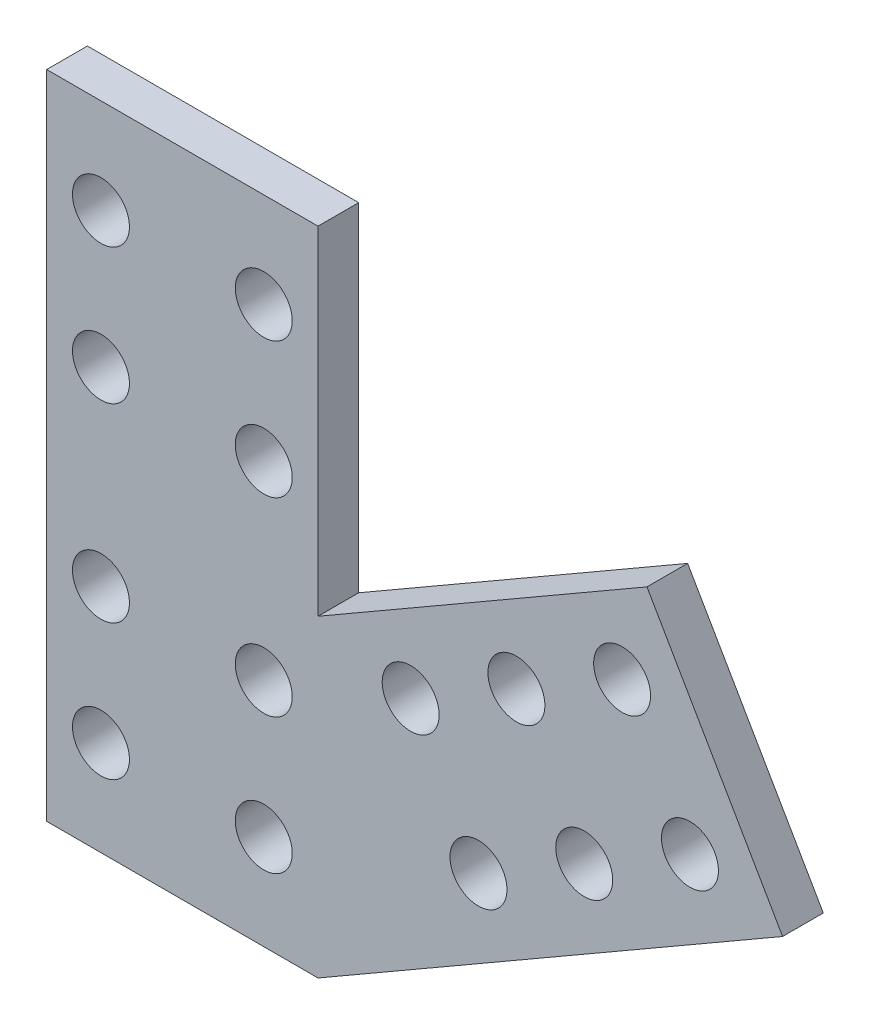
ISO-10303-21;
HEADER;
FILE_DESCRIPTION(('STEP AP214'),'2;1');
FILE_NAME('part.step','',(''),(''),'','','');
FILE_SCHEMA(('AUTOMOTIVE_DESIGN { 1 0 10303 214 1 1 1 1 }'));
ENDSEC;
DATA;
#1=APPLICATION_CONTEXT('core data for automotive mechanical design processes');
#2=APPLICATION_PROTOCOL_DEFINITION('international standard','automotive_design',2000,#1);
#3=PRODUCT_CONTEXT('',#1,'mechanical');
#4=PRODUCT('Part','Part','',(#3));
#5=PRODUCT_RELATED_PRODUCT_CATEGORY('part','',(#4));
#6=PRODUCT_DEFINITION_FORMATION('','',#4);
#7=PRODUCT_DEFINITION_CONTEXT('part definition',#1,'design');
#8=PRODUCT_DEFINITION('design','',#6,#7);
#9=PRODUCT_DEFINITION_SHAPE('','',#8);
#10=(LENGTH_UNIT() NAMED_UNIT(*) SI_UNIT(.MILLI.,.METRE.));
#11=(NAMED_UNIT(*) PLANE_ANGLE_UNIT() SI_UNIT($,.RADIAN.));
#12=(NAMED_UNIT(*) SI_UNIT($,.STERADIAN.) SOLID_ANGLE_UNIT());
#13=UNCERTAINTY_MEASURE_WITH_UNIT(LENGTH_MEASURE(1.E-05),#10,'distance_accuracy_value','');
#14=(GEOMETRIC_REPRESENTATION_CONTEXT(3) GLOBAL_UNCERTAINTY_ASSIGNED_CONTEXT((#13)) GLOBAL_UNIT_ASSIGNED_CONTEXT((#10,
#11,#12)) REPRESENTATION_CONTEXT('',''));
#15=CARTESIAN_POINT('',(0.,0.,0.));
#16=DIRECTION('',(0.,0.,1.));
#17=DIRECTION('',(1.,0.,0.));
#18=AXIS2_PLACEMENT_3D('',#15,#16,#17);
#19=CARTESIAN_POINT('',(0.,48.,3.));
#20=DIRECTION('',(0.,-1.,0.));
#21=DIRECTION('',(0.,0.,-1.));
#22=AXIS2_PLACEMENT_3D('',#19,#20,#21);
#23=PLANE('',#22);
#24=DIRECTION('',(-1.,0.,0.));
#25=VECTOR('',#24,1.);
#26=CARTESIAN_POINT('',(0.,48.,0.));
#27=LINE('',#26,#25);
#28=CARTESIAN_POINT('',(20.,48.,0.));
#29=VERTEX_POINT('',#28);
#30=CARTESIAN_POINT('',(0.,48.,0.));
#31=VERTEX_POINT('',#30);
#32=EDGE_CURVE('E125',#29,#31,#27,.T.);
#33=ORIENTED_EDGE('',*,*,#32,.T.);
#34=DIRECTION('',(0.,0.,-1.));
#35=VECTOR('',#34,1.);
#36=CARTESIAN_POINT('',(0.,48.,3.));
#37=LINE('',#36,#35);
#38=CARTESIAN_POINT('',(0.,48.,3.));
#39=VERTEX_POINT('',#38);
#40=EDGE_CURVE('E11',#39,#31,#37,.T.);
#41=ORIENTED_EDGE('',*,*,#40,.F.);
#42=DIRECTION('',(-1.,0.,0.));
#43=VECTOR('',#42,1.);
#44=CARTESIAN_POINT('',(0.,48.,3.));
#45=LINE('',#44,#43);
#46=CARTESIAN_POINT('',(20.,48.,3.));
#47=VERTEX_POINT('',#46);
#48=EDGE_CURVE('E138',#47,#39,#45,.T.);
#49=ORIENTED_EDGE('',*,*,#48,.F.);
#50=DIRECTION('',(0.,0.,-1.));
#51=VECTOR('',#50,1.);
#52=CARTESIAN_POINT('',(20.,48.,3.));
#53=LINE('',#52,#51);
#54=EDGE_CURVE('E121',#47,#29,#53,.T.);
#55=ORIENTED_EDGE('',*,*,#54,.T.);
#56=EDGE_LOOP('',(#33,#41,#49,#55));
#57=FACE_BOUND('',#56,.T.);
#58=ADVANCED_FACE('F35',(#57),#23,.F.);
#59=CARTESIAN_POINT('',(0.,48.,3.));
#60=DIRECTION('',(1.,0.,0.));
#61=DIRECTION('',(0.,1.,0.));
#62=AXIS2_PLACEMENT_3D('',#59,#60,#61);
#63=PLANE('',#62);
#64=DIRECTION('',(0.,-1.,0.));
#65=VECTOR('',#64,1.);
#66=CARTESIAN_POINT('',(0.,48.,0.));
#67=LINE('',#66,#65);
#68=CARTESIAN_POINT('',(0.,0.,0.));
#69=VERTEX_POINT('',#68);
#70=EDGE_CURVE('E128',#31,#69,#67,.T.);
#71=ORIENTED_EDGE('',*,*,#70,.T.);
#72=DIRECTION('',(0.,0.,-1.));
#73=VECTOR('',#72,1.);
#74=CARTESIAN_POINT('',(0.,0.,3.));
#75=LINE('',#74,#73);
#76=CARTESIAN_POINT('',(0.,0.,3.));
#77=VERTEX_POINT('',#76);
#78=EDGE_CURVE('E43',#77,#69,#75,.T.);
#79=ORIENTED_EDGE('',*,*,#78,.F.);
#80=DIRECTION('',(0.,-1.,0.));
#81=VECTOR('',#80,1.);
#82=CARTESIAN_POINT('',(0.,48.,3.));
#83=LINE('',#82,#81);
#84=EDGE_CURVE('E91',#39,#77,#83,.T.);
#85=ORIENTED_EDGE('',*,*,#84,.F.);
#86=ORIENTED_EDGE('',*,*,#40,.T.);
#87=EDGE_LOOP('',(#71,#79,#85,#86));
#88=FACE_BOUND('',#87,.T.);
#89=ADVANCED_FACE('F297',(#88),#63,.F.);
#90=CARTESIAN_POINT('',(20.,0.,3.));
#91=DIRECTION('',(0.,1.,0.));
#92=DIRECTION('',(-1.,0.,0.));
#93=AXIS2_PLACEMENT_3D('',#90,#91,#92);
#94=PLANE('',#93);
#95=DIRECTION('',(1.,0.,0.));
#96=VECTOR('',#95,1.);
#97=CARTESIAN_POINT('',(20.,0.,0.));
#98=LINE('',#97,#96);
#99=CARTESIAN_POINT('',(20.,0.,0.));
#100=VERTEX_POINT('',#99);
#101=EDGE_CURVE('E131',#69,#100,#98,.T.);
#102=ORIENTED_EDGE('',*,*,#101,.T.);
#103=DIRECTION('',(0.,0.,-1.));
#104=VECTOR('',#103,1.);
#105=CARTESIAN_POINT('',(20.,0.,3.));
#106=LINE('',#105,#104);
#107=CARTESIAN_POINT('',(20.,0.,3.));
#108=VERTEX_POINT('',#107);
#109=EDGE_CURVE('E142',#108,#100,#106,.T.);
#110=ORIENTED_EDGE('',*,*,#109,.F.);
#111=DIRECTION('',(1.,0.,0.));
#112=VECTOR('',#111,1.);
#113=CARTESIAN_POINT('',(20.,0.,3.));
#114=LINE('',#113,#112);
#115=EDGE_CURVE('E150',#77,#108,#114,.T.);
#116=ORIENTED_EDGE('',*,*,#115,.F.);
#117=ORIENTED_EDGE('',*,*,#78,.T.);
#118=EDGE_LOOP('',(#102,#110,#116,#117));
#119=FACE_BOUND('',#118,.T.);
#120=ADVANCED_FACE('F148',(#119),#94,.F.);
#121=CARTESIAN_POINT('',(54.2487113059647,19.7735026918969,3.));
#122=DIRECTION('',(-0.500000000000008,0.866025403784434,0.));
#123=DIRECTION('',(-0.866025403784434,-0.500000000000008,0.));
#124=AXIS2_PLACEMENT_3D('',#121,#122,#123);
#125=PLANE('',#124);
#126=DIRECTION('',(0.866025403784434,0.500000000000008,0.));
#127=VECTOR('',#126,1.);
#128=CARTESIAN_POINT('',(54.2487113059647,19.7735026918969,0.));
#129=LINE('',#128,#127);
#130=CARTESIAN_POINT('',(54.2487113059647,19.7735026918969,0.));
#131=VERTEX_POINT('',#130);
#132=EDGE_CURVE('E133',#100,#131,#129,.T.);
#133=ORIENTED_EDGE('',*,*,#132,.T.);
#134=DIRECTION('',(0.,0.,-1.));
#135=VECTOR('',#134,1.);
#136=CARTESIAN_POINT('',(54.2487113059647,19.7735026918969,3.));
#137=LINE('',#136,#135);
#138=CARTESIAN_POINT('',(54.2487113059647,19.7735026918969,3.));
#139=VERTEX_POINT('',#138);
#140=EDGE_CURVE('E116',#139,#131,#137,.T.);
#141=ORIENTED_EDGE('',*,*,#140,.F.);
#142=DIRECTION('',(0.866025403784434,0.500000000000008,0.));
#143=VECTOR('',#142,1.);
#144=CARTESIAN_POINT('',(54.2487113059647,19.7735026918969,3.));
#145=LINE('',#144,#143);
#146=EDGE_CURVE('E107',#108,#139,#145,.T.);
#147=ORIENTED_EDGE('',*,*,#146,.F.);
#148=ORIENTED_EDGE('',*,*,#109,.T.);
#149=EDGE_LOOP('',(#133,#141,#147,#148));
#150=FACE_BOUND('',#149,.T.);
#151=ADVANCED_FACE('F156',(#150),#125,.F.);
#152=CARTESIAN_POINT('',(44.2487113059642,37.0940107675854,3.));
#153=DIRECTION('',(-0.866025403784425,-0.500000000000025,0.));
#154=DIRECTION('',(0.500000000000025,-0.866025403784425,0.));
#155=AXIS2_PLACEMENT_3D('',#152,#153,#154);
#156=PLANE('',#155);
#157=DIRECTION('',(-0.500000000000025,0.866025403784424,0.));
#158=VECTOR('',#157,1.);
#159=CARTESIAN_POINT('',(44.2487113059642,37.0940107675854,0.));
#160=LINE('',#159,#158);
#161=CARTESIAN_POINT('',(44.2487113059642,37.0940107675854,0.));
#162=VERTEX_POINT('',#161);
#163=EDGE_CURVE('E115',#131,#162,#160,.T.);
#164=ORIENTED_EDGE('',*,*,#163,.T.);
#165=DIRECTION('',(0.,0.,-1.));
#166=VECTOR('',#165,1.);
#167=CARTESIAN_POINT('',(44.2487113059642,37.0940107675854,3.));
#168=LINE('',#167,#166);
#169=CARTESIAN_POINT('',(44.2487113059642,37.0940107675854,3.));
#170=VERTEX_POINT('',#169);
#171=EDGE_CURVE('E112',#170,#162,#168,.T.);
#172=ORIENTED_EDGE('',*,*,#171,.F.);
#173=DIRECTION('',(-0.500000000000025,0.866025403784424,0.));
#174=VECTOR('',#173,1.);
#175=CARTESIAN_POINT('',(44.2487113059642,37.0940107675854,3.));
#176=LINE('',#175,#174);
#177=EDGE_CURVE('E101',#139,#170,#176,.T.);
#178=ORIENTED_EDGE('',*,*,#177,.F.);
#179=ORIENTED_EDGE('',*,*,#140,.T.);
#180=EDGE_LOOP('',(#164,#172,#178,#179));
#181=FACE_BOUND('',#180,.T.);
#182=ADVANCED_FACE('F113',(#181),#156,.F.);
#183=CARTESIAN_POINT('',(20.,23.0940107675852,3.));
#184=DIRECTION('',(0.500000000000008,-0.866025403784434,0.));
#185=DIRECTION('',(0.866025403784434,0.500000000000008,0.));
#186=AXIS2_PLACEMENT_3D('',#183,#184,#185);
#187=PLANE('',#186);
#188=DIRECTION('',(-0.866025403784434,-0.500000000000008,0.));
#189=VECTOR('',#188,1.);
#190=CARTESIAN_POINT('',(20.,23.0940107675852,0.));
#191=LINE('',#190,#189);
#192=CARTESIAN_POINT('',(20.,23.0940107675852,0.));
#193=VERTEX_POINT('',#192);
#194=EDGE_CURVE('E77',#162,#193,#191,.T.);
#195=ORIENTED_EDGE('',*,*,#194,.T.);
#196=DIRECTION('',(0.,0.,-1.));
#197=VECTOR('',#196,1.);
#198=CARTESIAN_POINT('',(20.,23.0940107675852,3.));
#199=LINE('',#198,#197);
#200=CARTESIAN_POINT('',(20.,23.0940107675852,3.));
#201=VERTEX_POINT('',#200);
#202=EDGE_CURVE('E117',#201,#193,#199,.T.);
#203=ORIENTED_EDGE('',*,*,#202,.F.);
#204=DIRECTION('',(-0.866025403784434,-0.500000000000008,0.));
#205=VECTOR('',#204,1.);
#206=CARTESIAN_POINT('',(20.,23.0940107675852,3.));
#207=LINE('',#206,#205);
#208=EDGE_CURVE('E105',#170,#201,#207,.T.);
#209=ORIENTED_EDGE('',*,*,#208,.F.);
#210=ORIENTED_EDGE('',*,*,#171,.T.);
#211=EDGE_LOOP('',(#195,#203,#209,#210));
#212=FACE_BOUND('',#211,.T.);
#213=ADVANCED_FACE('F119',(#212),#187,.F.);
#214=CARTESIAN_POINT('',(20.,48.,3.));
#215=DIRECTION('',(-1.,0.,0.));
#216=DIRECTION('',(0.,-1.,0.));
#217=AXIS2_PLACEMENT_3D('',#214,#215,#216);
#218=PLANE('',#217);
#219=DIRECTION('',(0.,1.,0.));
#220=VECTOR('',#219,1.);
#221=CARTESIAN_POINT('',(20.,48.,0.));
#222=LINE('',#221,#220);
#223=EDGE_CURVE('E83',#193,#29,#222,.T.);
#224=ORIENTED_EDGE('',*,*,#223,.T.);
#225=ORIENTED_EDGE('',*,*,#54,.F.);
#226=DIRECTION('',(0.,1.,0.));
#227=VECTOR('',#226,1.);
#228=CARTESIAN_POINT('',(20.,48.,3.));
#229=LINE('',#228,#227);
#230=EDGE_CURVE('E51',#201,#47,#229,.T.);
#231=ORIENTED_EDGE('',*,*,#230,.F.);
#232=ORIENTED_EDGE('',*,*,#202,.T.);
#233=EDGE_LOOP('',(#224,#225,#231,#232));
#234=FACE_BOUND('',#233,.T.);
#235=ADVANCED_FACE('F304',(#234),#218,.F.);
#236=CARTESIAN_POINT('',(0.,0.,3.));
#237=DIRECTION('',(0.,0.,-1.));
#238=DIRECTION('',(-1.,0.,0.));
#239=AXIS2_PLACEMENT_3D('',#236,#237,#238);
#240=PLANE('',#239);
#241=CARTESIAN_POINT('',(47.4185842870425,21.6036297108191,3.));
#242=DIRECTION('',(0.,0.,-1.));
#243=DIRECTION('',(-1.,0.,0.));
#244=AXIS2_PLACEMENT_3D('',#241,#242,#243);
#245=CIRCLE('',#244,2.1);
#246=CARTESIAN_POINT('',(45.3185842870425,21.6036297108191,3.));
#247=VERTEX_POINT('',#246);
#248=EDGE_CURVE('E129',#247,#247,#245,.T.);
#249=ORIENTED_EDGE('',*,*,#248,.T.);
#250=EDGE_LOOP('',(#249));
#251=FACE_BOUND('',#250,.T.);
#252=CARTESIAN_POINT('',(4.,31.,3.));
#253=DIRECTION('',(0.,0.,-1.));
#254=DIRECTION('',(-1.,0.,0.));
#255=AXIS2_PLACEMENT_3D('',#252,#253,#254);
#256=CIRCLE('',#255,2.1);
#257=CARTESIAN_POINT('',(1.90000000000001,31.,3.));
#258=VERTEX_POINT('',#257);
#259=EDGE_CURVE('E226',#258,#258,#256,.T.);
#260=ORIENTED_EDGE('',*,*,#259,.T.);
#261=EDGE_LOOP('',(#260));
#262=FACE_BOUND('',#261,.T.);
#263=CARTESIAN_POINT('',(16.,41.,3.));
#264=DIRECTION('',(0.,0.,-1.));
#265=DIRECTION('',(-1.,0.,0.));
#266=AXIS2_PLACEMENT_3D('',#263,#264,#265);
#267=CIRCLE('',#266,2.1);
#268=CARTESIAN_POINT('',(13.9,41.,3.));
#269=VERTEX_POINT('',#268);
#270=EDGE_CURVE('E215',#269,#269,#267,.T.);
#271=ORIENTED_EDGE('',*,*,#270,.T.);
#272=EDGE_LOOP('',(#271));
#273=FACE_BOUND('',#272,.T.);
#274=CARTESIAN_POINT('',(16.,31.,3.));
#275=DIRECTION('',(0.,0.,-1.));
#276=DIRECTION('',(-1.,0.,0.));
#277=AXIS2_PLACEMENT_3D('',#274,#275,#276);
#278=CIRCLE('',#277,2.1);
#279=CARTESIAN_POINT('',(13.9,31.,3.));
#280=VERTEX_POINT('',#279);
#281=EDGE_CURVE('E214',#280,#280,#278,.T.);
#282=ORIENTED_EDGE('',*,*,#281,.T.);
#283=EDGE_LOOP('',(#282));
#284=FACE_BOUND('',#283,.T.);
#285=CARTESIAN_POINT('',(4.,17.,3.));
#286=DIRECTION('',(0.,0.,-1.));
#287=DIRECTION('',(-1.,0.,0.));
#288=AXIS2_PLACEMENT_3D('',#285,#286,#287);
#289=CIRCLE('',#288,2.1);
#290=CARTESIAN_POINT('',(1.9,17.,3.));
#291=VERTEX_POINT('',#290);
#292=EDGE_CURVE('E179',#291,#291,#289,.T.);
#293=ORIENTED_EDGE('',*,*,#292,.T.);
#294=EDGE_LOOP('',(#293));
#295=FACE_BOUND('',#294,.T.);
#296=CARTESIAN_POINT('',(4.,41.,3.));
#297=DIRECTION('',(0.,0.,-1.));
#298=DIRECTION('',(-1.,0.,0.));
#299=AXIS2_PLACEMENT_3D('',#296,#297,#298);
#300=CIRCLE('',#299,2.1);
#301=CARTESIAN_POINT('',(1.9,41.,3.));
#302=VERTEX_POINT('',#301);
#303=EDGE_CURVE('E227',#302,#302,#300,.T.);
#304=ORIENTED_EDGE('',*,*,#303,.T.);
#305=EDGE_LOOP('',(#304));
#306=FACE_BOUND('',#305,.T.);
#307=CARTESIAN_POINT('',(26.8301270189226,21.2638837486635,3.));
#308=DIRECTION('',(0.,0.,-1.));
#309=DIRECTION('',(-1.,0.,0.));
#310=AXIS2_PLACEMENT_3D('',#307,#308,#309);
#311=CIRCLE('',#310,2.1);
#312=CARTESIAN_POINT('',(24.7301270189226,21.2638837486635,3.));
#313=VERTEX_POINT('',#312);
#314=EDGE_CURVE('E171',#313,#313,#311,.T.);
#315=ORIENTED_EDGE('',*,*,#314,.T.);
#316=EDGE_LOOP('',(#315));
#317=FACE_BOUND('',#316,.T.);
#318=CARTESIAN_POINT('',(16.,7.,3.));
#319=DIRECTION('',(0.,0.,-1.));
#320=DIRECTION('',(-1.,0.,0.));
#321=AXIS2_PLACEMENT_3D('',#318,#319,#320);
#322=CIRCLE('',#321,2.1);
#323=CARTESIAN_POINT('',(13.9,7.,3.));
#324=VERTEX_POINT('',#323);
#325=EDGE_CURVE('E164',#324,#324,#322,.T.);
#326=ORIENTED_EDGE('',*,*,#325,.T.);
#327=EDGE_LOOP('',(#326));
#328=FACE_BOUND('',#327,.T.);
#329=CARTESIAN_POINT('',(16.,17.,3.));
#330=DIRECTION('',(0.,0.,-1.));
#331=DIRECTION('',(-1.,0.,0.));
#332=AXIS2_PLACEMENT_3D('',#329,#330,#331);
#333=CIRCLE('',#332,2.1);
#334=CARTESIAN_POINT('',(13.9,17.,3.));
#335=VERTEX_POINT('',#334);
#336=EDGE_CURVE('E165',#335,#335,#333,.T.);
#337=ORIENTED_EDGE('',*,*,#336,.T.);
#338=EDGE_LOOP('',(#337));
#339=FACE_BOUND('',#338,.T.);
#340=CARTESIAN_POINT('',(4.,7.,3.));
#341=DIRECTION('',(0.,0.,-1.));
#342=DIRECTION('',(-1.,0.,0.));
#343=AXIS2_PLACEMENT_3D('',#340,#341,#342);
#344=CIRCLE('',#343,2.1);
#345=CARTESIAN_POINT('',(1.9,7.,3.));
#346=VERTEX_POINT('',#345);
#347=EDGE_CURVE('E178',#346,#346,#344,.T.);
#348=ORIENTED_EDGE('',*,*,#347,.T.);
#349=EDGE_LOOP('',(#348));
#350=FACE_BOUND('',#349,.T.);
#351=CARTESIAN_POINT('',(31.8301270189226,12.6036297108191,3.));
#352=DIRECTION('',(0.,0.,-1.));
#353=DIRECTION('',(-1.,0.,0.));
#354=AXIS2_PLACEMENT_3D('',#351,#352,#353);
#355=CIRCLE('',#354,2.1);
#356=CARTESIAN_POINT('',(29.7301270189226,12.6036297108191,3.));
#357=VERTEX_POINT('',#356);
#358=EDGE_CURVE('E189',#357,#357,#355,.T.);
#359=ORIENTED_EDGE('',*,*,#358,.T.);
#360=EDGE_LOOP('',(#359));
#361=FACE_BOUND('',#360,.T.);
#362=CARTESIAN_POINT('',(39.6243556529825,17.1036297108191,3.));
#363=DIRECTION('',(0.,0.,-1.));
#364=DIRECTION('',(-1.,0.,0.));
#365=AXIS2_PLACEMENT_3D('',#362,#363,#364);
#366=CIRCLE('',#365,2.1);
#367=CARTESIAN_POINT('',(37.5243556529825,17.1036297108191,3.));
#368=VERTEX_POINT('',#367);
#369=EDGE_CURVE('E195',#368,#368,#366,.T.);
#370=ORIENTED_EDGE('',*,*,#369,.T.);
#371=EDGE_LOOP('',(#370));
#372=FACE_BOUND('',#371,.T.);
#373=CARTESIAN_POINT('',(34.6243556529825,25.7638837486635,3.));
#374=DIRECTION('',(0.,0.,-1.));
#375=DIRECTION('',(-1.,0.,0.));
#376=AXIS2_PLACEMENT_3D('',#373,#374,#375);
#377=CIRCLE('',#376,2.1);
#378=CARTESIAN_POINT('',(32.5243556529825,25.7638837486635,3.));
#379=VERTEX_POINT('',#378);
#380=EDGE_CURVE('E201',#379,#379,#377,.T.);
#381=ORIENTED_EDGE('',*,*,#380,.T.);
#382=EDGE_LOOP('',(#381));
#383=FACE_BOUND('',#382,.T.);
#384=CARTESIAN_POINT('',(42.4185842870425,30.2638837486635,3.));
#385=DIRECTION('',(0.,0.,-1.));
#386=DIRECTION('',(-1.,0.,0.));
#387=AXIS2_PLACEMENT_3D('',#384,#385,#386);
#388=CIRCLE('',#387,2.1);
#389=CARTESIAN_POINT('',(40.3185842870425,30.2638837486635,3.));
#390=VERTEX_POINT('',#389);
#391=EDGE_CURVE('E207',#390,#390,#388,.T.);
#392=ORIENTED_EDGE('',*,*,#391,.T.);
#393=EDGE_LOOP('',(#392));
#394=FACE_BOUND('',#393,.T.);
#395=ORIENTED_EDGE('',*,*,#48,.T.);
#396=ORIENTED_EDGE('',*,*,#84,.T.);
#397=ORIENTED_EDGE('',*,*,#115,.T.);
#398=ORIENTED_EDGE('',*,*,#146,.T.);
#399=ORIENTED_EDGE('',*,*,#177,.T.);
#400=ORIENTED_EDGE('',*,*,#208,.T.);
#401=ORIENTED_EDGE('',*,*,#230,.T.);
#402=EDGE_LOOP('',(#395,#396,#397,#398,#399,#400,#401));
#403=FACE_BOUND('',#402,.T.);
#404=ADVANCED_FACE('F103',(#251,#262,#273,#284,#295,#306,#317,#328,#339,#350,#361,#372,#383,
#394,#403),#240,.F.);
#405=CARTESIAN_POINT('',(0.,0.,0.));
#406=DIRECTION('',(0.,0.,-1.));
#407=DIRECTION('',(-1.,0.,0.));
#408=AXIS2_PLACEMENT_3D('',#405,#406,#407);
#409=PLANE('',#408);
#410=CARTESIAN_POINT('',(47.4185842870425,21.6036297108191,0.));
#411=DIRECTION('',(0.,0.,-1.));
#412=DIRECTION('',(-1.,0.,0.));
#413=AXIS2_PLACEMENT_3D('',#410,#411,#412);
#414=CIRCLE('',#413,2.1);
#415=CARTESIAN_POINT('',(45.3185842870425,21.6036297108191,0.));
#416=VERTEX_POINT('',#415);
#417=EDGE_CURVE('E210',#416,#416,#414,.T.);
#418=ORIENTED_EDGE('',*,*,#417,.F.);
#419=EDGE_LOOP('',(#418));
#420=FACE_BOUND('',#419,.T.);
#421=CARTESIAN_POINT('',(4.,31.,0.));
#422=DIRECTION('',(0.,0.,-1.));
#423=DIRECTION('',(-1.,0.,0.));
#424=AXIS2_PLACEMENT_3D('',#421,#422,#423);
#425=CIRCLE('',#424,2.1);
#426=CARTESIAN_POINT('',(1.90000000000001,31.,0.));
#427=VERTEX_POINT('',#426);
#428=EDGE_CURVE('E223',#427,#427,#425,.T.);
#429=ORIENTED_EDGE('',*,*,#428,.F.);
#430=EDGE_LOOP('',(#429));
#431=FACE_BOUND('',#430,.T.);
#432=CARTESIAN_POINT('',(16.,41.,0.));
#433=DIRECTION('',(0.,0.,-1.));
#434=DIRECTION('',(-1.,0.,0.));
#435=AXIS2_PLACEMENT_3D('',#432,#433,#434);
#436=CIRCLE('',#435,2.1);
#437=CARTESIAN_POINT('',(13.9,41.,0.));
#438=VERTEX_POINT('',#437);
#439=EDGE_CURVE('E230',#438,#438,#436,.T.);
#440=ORIENTED_EDGE('',*,*,#439,.F.);
#441=EDGE_LOOP('',(#440));
#442=FACE_BOUND('',#441,.T.);
#443=CARTESIAN_POINT('',(16.,31.,0.));
#444=DIRECTION('',(0.,0.,-1.));
#445=DIRECTION('',(-1.,0.,0.));
#446=AXIS2_PLACEMENT_3D('',#443,#444,#445);
#447=CIRCLE('',#446,2.1);
#448=CARTESIAN_POINT('',(13.9,31.,0.));
#449=VERTEX_POINT('',#448);
#450=EDGE_CURVE('E211',#449,#449,#447,.T.);
#451=ORIENTED_EDGE('',*,*,#450,.F.);
#452=EDGE_LOOP('',(#451));
#453=FACE_BOUND('',#452,.T.);
#454=CARTESIAN_POINT('',(4.,17.,0.));
#455=DIRECTION('',(0.,0.,-1.));
#456=DIRECTION('',(-1.,0.,0.));
#457=AXIS2_PLACEMENT_3D('',#454,#455,#456);
#458=CIRCLE('',#457,2.1);
#459=CARTESIAN_POINT('',(1.9,17.,0.));
#460=VERTEX_POINT('',#459);
#461=EDGE_CURVE('E218',#460,#460,#458,.T.);
#462=ORIENTED_EDGE('',*,*,#461,.F.);
#463=EDGE_LOOP('',(#462));
#464=FACE_BOUND('',#463,.T.);
#465=CARTESIAN_POINT('',(4.,41.,0.));
#466=DIRECTION('',(0.,0.,-1.));
#467=DIRECTION('',(-1.,0.,0.));
#468=AXIS2_PLACEMENT_3D('',#465,#466,#467);
#469=CIRCLE('',#468,2.1);
#470=CARTESIAN_POINT('',(1.9,41.,0.));
#471=VERTEX_POINT('',#470);
#472=EDGE_CURVE('E235',#471,#471,#469,.T.);
#473=ORIENTED_EDGE('',*,*,#472,.F.);
#474=EDGE_LOOP('',(#473));
#475=FACE_BOUND('',#474,.T.);
#476=CARTESIAN_POINT('',(26.8301270189226,21.2638837486635,0.));
#477=DIRECTION('',(0.,0.,-1.));
#478=DIRECTION('',(-1.,0.,0.));
#479=AXIS2_PLACEMENT_3D('',#476,#477,#478);
#480=CIRCLE('',#479,2.1);
#481=CARTESIAN_POINT('',(24.7301270189226,21.2638837486635,0.));
#482=VERTEX_POINT('',#481);
#483=EDGE_CURVE('E168',#482,#482,#480,.T.);
#484=ORIENTED_EDGE('',*,*,#483,.F.);
#485=EDGE_LOOP('',(#484));
#486=FACE_BOUND('',#485,.T.);
#487=CARTESIAN_POINT('',(16.,7.,0.));
#488=DIRECTION('',(0.,0.,-1.));
#489=DIRECTION('',(-1.,0.,0.));
#490=AXIS2_PLACEMENT_3D('',#487,#488,#489);
#491=CIRCLE('',#490,2.1);
#492=CARTESIAN_POINT('',(13.9,7.,0.));
#493=VERTEX_POINT('',#492);
#494=EDGE_CURVE('E161',#493,#493,#491,.T.);
#495=ORIENTED_EDGE('',*,*,#494,.F.);
#496=EDGE_LOOP('',(#495));
#497=FACE_BOUND('',#496,.T.);
#498=CARTESIAN_POINT('',(16.,17.,0.));
#499=DIRECTION('',(0.,0.,-1.));
#500=DIRECTION('',(-1.,0.,0.));
#501=AXIS2_PLACEMENT_3D('',#498,#499,#500);
#502=CIRCLE('',#501,2.1);
#503=CARTESIAN_POINT('',(13.9,17.,0.));
#504=VERTEX_POINT('',#503);
#505=EDGE_CURVE('E182',#504,#504,#502,.T.);
#506=ORIENTED_EDGE('',*,*,#505,.F.);
#507=EDGE_LOOP('',(#506));
#508=FACE_BOUND('',#507,.T.);
#509=CARTESIAN_POINT('',(4.,7.,0.));
#510=DIRECTION('',(0.,0.,-1.));
#511=DIRECTION('',(-1.,0.,0.));
#512=AXIS2_PLACEMENT_3D('',#509,#510,#511);
#513=CIRCLE('',#512,2.1);
#514=CARTESIAN_POINT('',(1.9,7.,0.));
#515=VERTEX_POINT('',#514);
#516=EDGE_CURVE('E175',#515,#515,#513,.T.);
#517=ORIENTED_EDGE('',*,*,#516,.F.);
#518=EDGE_LOOP('',(#517));
#519=FACE_BOUND('',#518,.T.);
#520=CARTESIAN_POINT('',(31.8301270189226,12.6036297108191,0.));
#521=DIRECTION('',(0.,0.,-1.));
#522=DIRECTION('',(-1.,0.,0.));
#523=AXIS2_PLACEMENT_3D('',#520,#521,#522);
#524=CIRCLE('',#523,2.1);
#525=CARTESIAN_POINT('',(29.7301270189226,12.6036297108191,0.));
#526=VERTEX_POINT('',#525);
#527=EDGE_CURVE('E174',#526,#526,#524,.T.);
#528=ORIENTED_EDGE('',*,*,#527,.F.);
#529=EDGE_LOOP('',(#528));
#530=FACE_BOUND('',#529,.T.);
#531=CARTESIAN_POINT('',(39.6243556529825,17.1036297108191,0.));
#532=DIRECTION('',(0.,0.,-1.));
#533=DIRECTION('',(-1.,0.,0.));
#534=AXIS2_PLACEMENT_3D('',#531,#532,#533);
#535=CIRCLE('',#534,2.1);
#536=CARTESIAN_POINT('',(37.5243556529825,17.1036297108191,0.));
#537=VERTEX_POINT('',#536);
#538=EDGE_CURVE('E192',#537,#537,#535,.T.);
#539=ORIENTED_EDGE('',*,*,#538,.F.);
#540=EDGE_LOOP('',(#539));
#541=FACE_BOUND('',#540,.T.);
#542=CARTESIAN_POINT('',(34.6243556529825,25.7638837486635,0.));
#543=DIRECTION('',(0.,0.,-1.));
#544=DIRECTION('',(-1.,0.,0.));
#545=AXIS2_PLACEMENT_3D('',#542,#543,#544);
#546=CIRCLE('',#545,2.1);
#547=CARTESIAN_POINT('',(32.5243556529825,25.7638837486635,0.));
#548=VERTEX_POINT('',#547);
#549=EDGE_CURVE('E198',#548,#548,#546,.T.);
#550=ORIENTED_EDGE('',*,*,#549,.F.);
#551=EDGE_LOOP('',(#550));
#552=FACE_BOUND('',#551,.T.);
#553=CARTESIAN_POINT('',(42.4185842870425,30.2638837486635,0.));
#554=DIRECTION('',(0.,0.,-1.));
#555=DIRECTION('',(-1.,0.,0.));
#556=AXIS2_PLACEMENT_3D('',#553,#554,#555);
#557=CIRCLE('',#556,2.1);
#558=CARTESIAN_POINT('',(40.3185842870425,30.2638837486635,0.));
#559=VERTEX_POINT('',#558);
#560=EDGE_CURVE('E204',#559,#559,#557,.T.);
#561=ORIENTED_EDGE('',*,*,#560,.F.);
#562=EDGE_LOOP('',(#561));
#563=FACE_BOUND('',#562,.T.);
#564=ORIENTED_EDGE('',*,*,#32,.F.);
#565=ORIENTED_EDGE('',*,*,#223,.F.);
#566=ORIENTED_EDGE('',*,*,#194,.F.);
#567=ORIENTED_EDGE('',*,*,#163,.F.);
#568=ORIENTED_EDGE('',*,*,#132,.F.);
#569=ORIENTED_EDGE('',*,*,#101,.F.);
#570=ORIENTED_EDGE('',*,*,#70,.F.);
#571=EDGE_LOOP('',(#564,#565,#566,#567,#568,#569,#570));
#572=FACE_BOUND('',#571,.T.);
#573=ADVANCED_FACE('F154',(#420,#431,#442,#453,#464,#475,#486,#497,#508,#519,#530,#541,#552,
#563,#572),#409,.T.);
#574=CARTESIAN_POINT('',(42.4185842870425,30.2638837486635,3.));
#575=DIRECTION('',(0.,0.,-1.));
#576=DIRECTION('',(-1.,0.,0.));
#577=AXIS2_PLACEMENT_3D('',#574,#575,#576);
#578=CYLINDRICAL_SURFACE('',#577,2.1);
#579=ORIENTED_EDGE('',*,*,#391,.F.);
#580=EDGE_LOOP('',(#579));
#581=FACE_BOUND('',#580,.T.);
#582=ORIENTED_EDGE('',*,*,#560,.T.);
#583=EDGE_LOOP('',(#582));
#584=FACE_BOUND('',#583,.T.);
#585=ADVANCED_FACE('F256',(#581,#584),#578,.F.);
#586=CARTESIAN_POINT('',(34.6243556529825,25.7638837486635,3.));
#587=DIRECTION('',(0.,0.,-1.));
#588=DIRECTION('',(-1.,0.,0.));
#589=AXIS2_PLACEMENT_3D('',#586,#587,#588);
#590=CYLINDRICAL_SURFACE('',#589,2.1);
#591=ORIENTED_EDGE('',*,*,#380,.F.);
#592=EDGE_LOOP('',(#591));
#593=FACE_BOUND('',#592,.T.);
#594=ORIENTED_EDGE('',*,*,#549,.T.);
#595=EDGE_LOOP('',(#594));
#596=FACE_BOUND('',#595,.T.);
#597=ADVANCED_FACE('F285',(#593,#596),#590,.F.);
#598=CARTESIAN_POINT('',(39.6243556529825,17.1036297108191,3.));
#599=DIRECTION('',(0.,0.,-1.));
#600=DIRECTION('',(-1.,0.,0.));
#601=AXIS2_PLACEMENT_3D('',#598,#599,#600);
#602=CYLINDRICAL_SURFACE('',#601,2.1);
#603=ORIENTED_EDGE('',*,*,#369,.F.);
#604=EDGE_LOOP('',(#603));
#605=FACE_BOUND('',#604,.T.);
#606=ORIENTED_EDGE('',*,*,#538,.T.);
#607=EDGE_LOOP('',(#606));
#608=FACE_BOUND('',#607,.T.);
#609=ADVANCED_FACE('F291',(#605,#608),#602,.F.);
#610=CARTESIAN_POINT('',(31.8301270189226,12.6036297108191,3.));
#611=DIRECTION('',(0.,0.,-1.));
#612=DIRECTION('',(-1.,0.,0.));
#613=AXIS2_PLACEMENT_3D('',#610,#611,#612);
#614=CYLINDRICAL_SURFACE('',#613,2.1);
#615=ORIENTED_EDGE('',*,*,#358,.F.);
#616=EDGE_LOOP('',(#615));
#617=FACE_BOUND('',#616,.T.);
#618=ORIENTED_EDGE('',*,*,#527,.T.);
#619=EDGE_LOOP('',(#618));
#620=FACE_BOUND('',#619,.T.);
#621=ADVANCED_FACE('F370',(#617,#620),#614,.F.);
#622=CARTESIAN_POINT('',(4.,7.,3.));
#623=DIRECTION('',(0.,0.,-1.));
#624=DIRECTION('',(-1.,0.,0.));
#625=AXIS2_PLACEMENT_3D('',#622,#623,#624);
#626=CYLINDRICAL_SURFACE('',#625,2.1);
#627=ORIENTED_EDGE('',*,*,#347,.F.);
#628=EDGE_LOOP('',(#627));
#629=FACE_BOUND('',#628,.T.);
#630=ORIENTED_EDGE('',*,*,#516,.T.);
#631=EDGE_LOOP('',(#630));
#632=FACE_BOUND('',#631,.T.);
#633=ADVANCED_FACE('F380',(#629,#632),#626,.F.);
#634=CARTESIAN_POINT('',(16.,17.,3.));
#635=DIRECTION('',(0.,0.,-1.));
#636=DIRECTION('',(-1.,0.,0.));
#637=AXIS2_PLACEMENT_3D('',#634,#635,#636);
#638=CYLINDRICAL_SURFACE('',#637,2.1);
#639=ORIENTED_EDGE('',*,*,#336,.F.);
#640=EDGE_LOOP('',(#639));
#641=FACE_BOUND('',#640,.T.);
#642=ORIENTED_EDGE('',*,*,#505,.T.);
#643=EDGE_LOOP('',(#642));
#644=FACE_BOUND('',#643,.T.);
#645=ADVANCED_FACE('F390',(#641,#644),#638,.F.);
#646=CARTESIAN_POINT('',(16.,7.,3.));
#647=DIRECTION('',(0.,0.,-1.));
#648=DIRECTION('',(-1.,0.,0.));
#649=AXIS2_PLACEMENT_3D('',#646,#647,#648);
#650=CYLINDRICAL_SURFACE('',#649,2.1);
#651=ORIENTED_EDGE('',*,*,#325,.F.);
#652=EDGE_LOOP('',(#651));
#653=FACE_BOUND('',#652,.T.);
#654=ORIENTED_EDGE('',*,*,#494,.T.);
#655=EDGE_LOOP('',(#654));
#656=FACE_BOUND('',#655,.T.);
#657=ADVANCED_FACE('F400',(#653,#656),#650,.F.);
#658=CARTESIAN_POINT('',(26.8301270189226,21.2638837486635,3.));
#659=DIRECTION('',(0.,0.,-1.));
#660=DIRECTION('',(-1.,0.,0.));
#661=AXIS2_PLACEMENT_3D('',#658,#659,#660);
#662=CYLINDRICAL_SURFACE('',#661,2.1);
#663=ORIENTED_EDGE('',*,*,#314,.F.);
#664=EDGE_LOOP('',(#663));
#665=FACE_BOUND('',#664,.T.);
#666=ORIENTED_EDGE('',*,*,#483,.T.);
#667=EDGE_LOOP('',(#666));
#668=FACE_BOUND('',#667,.T.);
#669=ADVANCED_FACE('F410',(#665,#668),#662,.F.);
#670=CARTESIAN_POINT('',(4.,41.,3.));
#671=DIRECTION('',(0.,0.,-1.));
#672=DIRECTION('',(-1.,0.,0.));
#673=AXIS2_PLACEMENT_3D('',#670,#671,#672);
#674=CYLINDRICAL_SURFACE('',#673,2.1);
#675=ORIENTED_EDGE('',*,*,#303,.F.);
#676=EDGE_LOOP('',(#675));
#677=FACE_BOUND('',#676,.T.);
#678=ORIENTED_EDGE('',*,*,#472,.T.);
#679=EDGE_LOOP('',(#678));
#680=FACE_BOUND('',#679,.T.);
#681=ADVANCED_FACE('F420',(#677,#680),#674,.F.);
#682=CARTESIAN_POINT('',(4.,17.,3.));
#683=DIRECTION('',(0.,0.,-1.));
#684=DIRECTION('',(-1.,0.,0.));
#685=AXIS2_PLACEMENT_3D('',#682,#683,#684);
#686=CYLINDRICAL_SURFACE('',#685,2.1);
#687=ORIENTED_EDGE('',*,*,#292,.F.);
#688=EDGE_LOOP('',(#687));
#689=FACE_BOUND('',#688,.T.);
#690=ORIENTED_EDGE('',*,*,#461,.T.);
#691=EDGE_LOOP('',(#690));
#692=FACE_BOUND('',#691,.T.);
#693=ADVANCED_FACE('F430',(#689,#692),#686,.F.);
#694=CARTESIAN_POINT('',(16.,31.,3.));
#695=DIRECTION('',(0.,0.,-1.));
#696=DIRECTION('',(-1.,0.,0.));
#697=AXIS2_PLACEMENT_3D('',#694,#695,#696);
#698=CYLINDRICAL_SURFACE('',#697,2.1);
#699=ORIENTED_EDGE('',*,*,#281,.F.);
#700=EDGE_LOOP('',(#699));
#701=FACE_BOUND('',#700,.T.);
#702=ORIENTED_EDGE('',*,*,#450,.T.);
#703=EDGE_LOOP('',(#702));
#704=FACE_BOUND('',#703,.T.);
#705=ADVANCED_FACE('F440',(#701,#704),#698,.F.);
#706=CARTESIAN_POINT('',(16.,41.,3.));
#707=DIRECTION('',(0.,0.,-1.));
#708=DIRECTION('',(-1.,0.,0.));
#709=AXIS2_PLACEMENT_3D('',#706,#707,#708);
#710=CYLINDRICAL_SURFACE('',#709,2.1);
#711=ORIENTED_EDGE('',*,*,#270,.F.);
#712=EDGE_LOOP('',(#711));
#713=FACE_BOUND('',#712,.T.);
#714=ORIENTED_EDGE('',*,*,#439,.T.);
#715=EDGE_LOOP('',(#714));
#716=FACE_BOUND('',#715,.T.);
#717=ADVANCED_FACE('F450',(#713,#716),#710,.F.);
#718=CARTESIAN_POINT('',(4.,31.,3.));
#719=DIRECTION('',(0.,0.,-1.));
#720=DIRECTION('',(-1.,0.,0.));
#721=AXIS2_PLACEMENT_3D('',#718,#719,#720);
#722=CYLINDRICAL_SURFACE('',#721,2.1);
#723=ORIENTED_EDGE('',*,*,#259,.F.);
#724=EDGE_LOOP('',(#723));
#725=FACE_BOUND('',#724,.T.);
#726=ORIENTED_EDGE('',*,*,#428,.T.);
#727=EDGE_LOOP('',(#726));
#728=FACE_BOUND('',#727,.T.);
#729=ADVANCED_FACE('F250',(#725,#728),#722,.F.);
#730=CARTESIAN_POINT('',(47.4185842870425,21.6036297108191,3.));
#731=DIRECTION('',(0.,0.,-1.));
#732=DIRECTION('',(-1.,0.,0.));
#733=AXIS2_PLACEMENT_3D('',#730,#731,#732);
#734=CYLINDRICAL_SURFACE('',#733,2.1);
#735=ORIENTED_EDGE('',*,*,#248,.F.);
#736=EDGE_LOOP('',(#735));
#737=FACE_BOUND('',#736,.T.);
#738=ORIENTED_EDGE('',*,*,#417,.T.);
#739=EDGE_LOOP('',(#738));
#740=FACE_BOUND('',#739,.T.);
#741=ADVANCED_FACE('F247',(#737,#740),#734,.F.);
#742=CLOSED_SHELL('',(#58,#89,#120,#151,#182,#213,#235,#404,#573,#585,#597,#609,#621,#633,#645,
#657,#669,#681,#693,#705,#717,#729,#741));
#743=MANIFOLD_SOLID_BREP('B2',#742);
#744=ADVANCED_BREP_SHAPE_REPRESENTATION('',(#18,#743),#14);
#745=SHAPE_DEFINITION_REPRESENTATION(#9,#744);
ENDSEC;
END-ISO-10303-21;
